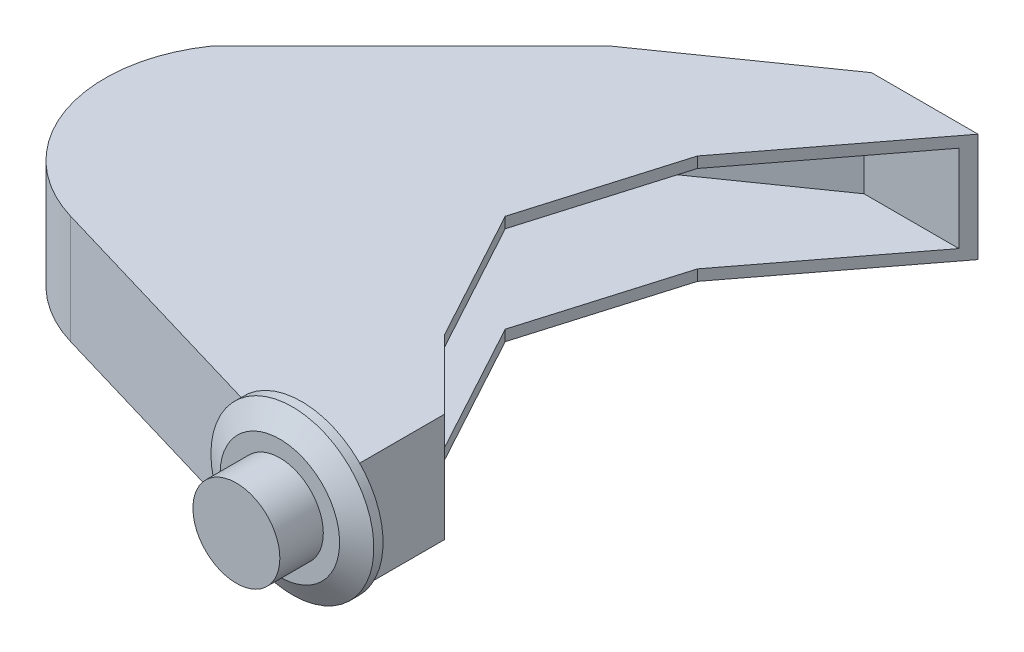
ISO-10303-21;
HEADER;
FILE_DESCRIPTION(('STEP AP214'),'2;1');
FILE_NAME('part.step','',(''),(''),'','','');
FILE_SCHEMA(('AUTOMOTIVE_DESIGN { 1 0 10303 214 1 1 1 1 }'));
ENDSEC;
DATA;
#1=APPLICATION_CONTEXT('core data for automotive mechanical design processes');
#2=APPLICATION_PROTOCOL_DEFINITION('international standard','automotive_design',2000,#1);
#3=PRODUCT_CONTEXT('',#1,'mechanical');
#4=PRODUCT('Part','Part','',(#3));
#5=PRODUCT_RELATED_PRODUCT_CATEGORY('part','',(#4));
#6=PRODUCT_DEFINITION_FORMATION('','',#4);
#7=PRODUCT_DEFINITION_CONTEXT('part definition',#1,'design');
#8=PRODUCT_DEFINITION('design','',#6,#7);
#9=PRODUCT_DEFINITION_SHAPE('','',#8);
#10=(LENGTH_UNIT() NAMED_UNIT(*) SI_UNIT(.MILLI.,.METRE.));
#11=(NAMED_UNIT(*) PLANE_ANGLE_UNIT() SI_UNIT($,.RADIAN.));
#12=(NAMED_UNIT(*) SI_UNIT($,.STERADIAN.) SOLID_ANGLE_UNIT());
#13=UNCERTAINTY_MEASURE_WITH_UNIT(LENGTH_MEASURE(1.E-05),#10,'distance_accuracy_value','');
#14=(GEOMETRIC_REPRESENTATION_CONTEXT(3) GLOBAL_UNCERTAINTY_ASSIGNED_CONTEXT((#13)) GLOBAL_UNIT_ASSIGNED_CONTEXT((#10,
#11,#12)) REPRESENTATION_CONTEXT('',''));
#15=CARTESIAN_POINT('',(0.,0.,0.));
#16=DIRECTION('',(0.,0.,1.));
#17=DIRECTION('',(1.,0.,0.));
#18=AXIS2_PLACEMENT_3D('',#15,#16,#17);
#19=CARTESIAN_POINT('',(-1.21758809619156,5.,-20.3540098135883));
#20=DIRECTION('',(-0.707106781186546,0.,0.707106781186549));
#21=DIRECTION('',(0.707106781186549,0.,0.707106781186546));
#22=AXIS2_PLACEMENT_3D('',#19,#20,#21);
#23=PLANE('',#22);
#24=DIRECTION('',(-0.707106781186549,0.,-0.707106781186546));
#25=VECTOR('',#24,1.);
#26=CARTESIAN_POINT('',(-15.1417044265505,-4.,-34.2781261439471));
#27=LINE('',#26,#25);
#28=CARTESIAN_POINT('',(4.09320586004261,-4.,-15.0432158573541));
#29=VERTEX_POINT('',#28);
#30=CARTESIAN_POINT('',(-1.21758809619156,-4.,-20.3540098135883));
#31=VERTEX_POINT('',#30);
#32=EDGE_CURVE('E316',#29,#31,#27,.T.);
#33=ORIENTED_EDGE('',*,*,#32,.F.);
#34=DIRECTION('',(0.,-1.,0.));
#35=VECTOR('',#34,1.);
#36=CARTESIAN_POINT('',(4.09320586004261,5.,-15.0432158573541));
#37=LINE('',#36,#35);
#38=CARTESIAN_POINT('',(4.09320586004261,4.,-15.0432158573541));
#39=VERTEX_POINT('',#38);
#40=EDGE_CURVE('E173',#39,#29,#37,.T.);
#41=ORIENTED_EDGE('',*,*,#40,.F.);
#42=DIRECTION('',(-0.707106781186549,0.,-0.707106781186546));
#43=VECTOR('',#42,1.);
#44=CARTESIAN_POINT('',(-15.1417044265505,4.,-34.2781261439471));
#45=LINE('',#44,#43);
#46=CARTESIAN_POINT('',(-1.21758809619156,4.,-20.3540098135883));
#47=VERTEX_POINT('',#46);
#48=EDGE_CURVE('E268',#39,#47,#45,.T.);
#49=ORIENTED_EDGE('',*,*,#48,.T.);
#50=DIRECTION('',(0.,-1.,0.));
#51=VECTOR('',#50,1.);
#52=CARTESIAN_POINT('',(-1.21758809619156,5.,-20.3540098135883));
#53=LINE('',#52,#51);
#54=CARTESIAN_POINT('',(-1.21758809619156,5.,-20.3540098135883));
#55=VERTEX_POINT('',#54);
#56=EDGE_CURVE('E50',#55,#47,#53,.T.);
#57=ORIENTED_EDGE('',*,*,#56,.F.);
#58=DIRECTION('',(-0.707106781186549,0.,-0.707106781186546));
#59=VECTOR('',#58,1.);
#60=CARTESIAN_POINT('',(-1.21758809619156,5.,-20.3540098135883));
#61=LINE('',#60,#59);
#62=CARTESIAN_POINT('',(5.09320586004261,5.,-14.0432158573541));
#63=VERTEX_POINT('',#62);
#64=EDGE_CURVE('E116',#63,#55,#61,.T.);
#65=ORIENTED_EDGE('',*,*,#64,.F.);
#66=DIRECTION('',(0.,-1.,0.));
#67=VECTOR('',#66,1.);
#68=CARTESIAN_POINT('',(5.09320586004261,5.,-14.0432158573541));
#69=LINE('',#68,#67);
#70=CARTESIAN_POINT('',(5.09320586004261,-5.,-14.0432158573541));
#71=VERTEX_POINT('',#70);
#72=EDGE_CURVE('E12',#63,#71,#69,.T.);
#73=ORIENTED_EDGE('',*,*,#72,.T.);
#74=DIRECTION('',(-0.707106781186549,0.,-0.707106781186546));
#75=VECTOR('',#74,1.);
#76=CARTESIAN_POINT('',(-1.21758809619156,-5.,-20.3540098135883));
#77=LINE('',#76,#75);
#78=CARTESIAN_POINT('',(-1.21758809619156,-5.,-20.3540098135883));
#79=VERTEX_POINT('',#78);
#80=EDGE_CURVE('E172',#71,#79,#77,.T.);
#81=ORIENTED_EDGE('',*,*,#80,.T.);
#82=EDGE_CURVE('E214',#31,#79,#53,.T.);
#83=ORIENTED_EDGE('',*,*,#82,.F.);
#84=EDGE_LOOP('',(#33,#41,#49,#57,#65,#73,#81,#83));
#85=FACE_BOUND('',#84,.T.);
#86=ADVANCED_FACE('F42',(#85),#23,.F.);
#87=CARTESIAN_POINT('',(-7.88833502325543,5.,-32.6318158692113));
#88=DIRECTION('',(-0.878683767214562,0.,0.477404270229776));
#89=DIRECTION('',(0.477404270229776,0.,0.878683767214562));
#90=AXIS2_PLACEMENT_3D('',#87,#88,#89);
#91=PLANE('',#90);
#92=DIRECTION('',(-0.477404270229776,0.,-0.878683767214562));
#93=VECTOR('',#92,1.);
#94=CARTESIAN_POINT('',(-8.49447980511238,-4.,-33.7474522671496));
#95=LINE('',#94,#93);
#96=CARTESIAN_POINT('',(-7.88833502325543,-4.,-32.6318158692113));
#97=VERTEX_POINT('',#96);
#98=EDGE_CURVE('E229',#31,#97,#95,.T.);
#99=ORIENTED_EDGE('',*,*,#98,.F.);
#100=ORIENTED_EDGE('',*,*,#82,.T.);
#101=DIRECTION('',(-0.477404270229776,0.,-0.878683767214562));
#102=VECTOR('',#101,1.);
#103=CARTESIAN_POINT('',(-7.88833502325543,-5.,-32.6318158692113));
#104=LINE('',#103,#102);
#105=CARTESIAN_POINT('',(-7.88833502325543,-5.,-32.6318158692113));
#106=VERTEX_POINT('',#105);
#107=EDGE_CURVE('E176',#79,#106,#104,.T.);
#108=ORIENTED_EDGE('',*,*,#107,.T.);
#109=DIRECTION('',(0.,-1.,0.));
#110=VECTOR('',#109,1.);
#111=CARTESIAN_POINT('',(-7.88833502325543,5.,-32.6318158692113));
#112=LINE('',#111,#110);
#113=EDGE_CURVE('E211',#97,#106,#112,.T.);
#114=ORIENTED_EDGE('',*,*,#113,.F.);
#115=EDGE_LOOP('',(#99,#100,#108,#114));
#116=FACE_BOUND('',#115,.T.);
#117=ADVANCED_FACE('F223',(#116),#91,.F.);
#118=CARTESIAN_POINT('',(-3.8479647744159,5.,-46.2858844235903));
#119=DIRECTION('',(-0.958899047162844,0.,-0.283747453469084));
#120=DIRECTION('',(-0.283747453469084,0.,0.958899047162844));
#121=AXIS2_PLACEMENT_3D('',#118,#119,#120);
#122=PLANE('',#121);
#123=DIRECTION('',(0.283747453469084,0.,-0.958899047162844));
#124=VECTOR('',#123,1.);
#125=CARTESIAN_POINT('',(-11.2225384643328,-4.,-21.3641746495007));
#126=LINE('',#125,#124);
#127=CARTESIAN_POINT('',(-3.8479647744159,-4.,-46.2858844235903));
#128=VERTEX_POINT('',#127);
#129=EDGE_CURVE('E244',#97,#128,#126,.T.);
#130=ORIENTED_EDGE('',*,*,#129,.F.);
#131=ORIENTED_EDGE('',*,*,#113,.T.);
#132=DIRECTION('',(0.283747453469084,0.,-0.958899047162844));
#133=VECTOR('',#132,1.);
#134=CARTESIAN_POINT('',(-3.8479647744159,-5.,-46.2858844235903));
#135=LINE('',#134,#133);
#136=CARTESIAN_POINT('',(-3.8479647744159,-5.,-46.2858844235903));
#137=VERTEX_POINT('',#136);
#138=EDGE_CURVE('E179',#106,#137,#135,.T.);
#139=ORIENTED_EDGE('',*,*,#138,.T.);
#140=DIRECTION('',(0.,-1.,0.));
#141=VECTOR('',#140,1.);
#142=CARTESIAN_POINT('',(-3.8479647744159,5.,-46.2858844235903));
#143=LINE('',#142,#141);
#144=EDGE_CURVE('E207',#128,#137,#143,.T.);
#145=ORIENTED_EDGE('',*,*,#144,.F.);
#146=EDGE_LOOP('',(#130,#131,#139,#145));
#147=FACE_BOUND('',#146,.T.);
#148=ADVANCED_FACE('F240',(#147),#122,.F.);
#149=CARTESIAN_POINT('',(7.3235458609851,5.,-60.9329761455605));
#150=DIRECTION('',(-0.795122252877776,0.,-0.606449175923728));
#151=DIRECTION('',(-0.606449175923728,0.,0.795122252877777));
#152=AXIS2_PLACEMENT_3D('',#149,#150,#151);
#153=PLANE('',#152);
#154=DIRECTION('',(0.606449175923728,0.,-0.795122252877777));
#155=VECTOR('',#154,1.);
#156=CARTESIAN_POINT('',(-21.5012922634337,-4.,-23.1404106046558));
#157=LINE('',#156,#155);
#158=CARTESIAN_POINT('',(6.56083399657832,-4.,-59.9329761455605));
#159=VERTEX_POINT('',#158);
#160=EDGE_CURVE('E323',#128,#159,#157,.T.);
#161=ORIENTED_EDGE('',*,*,#160,.F.);
#162=ORIENTED_EDGE('',*,*,#144,.T.);
#163=DIRECTION('',(0.606449175923728,0.,-0.795122252877776));
#164=VECTOR('',#163,1.);
#165=CARTESIAN_POINT('',(7.3235458609851,-5.,-60.9329761455605));
#166=LINE('',#165,#164);
#167=CARTESIAN_POINT('',(7.3235458609851,-5.,-60.9329761455605));
#168=VERTEX_POINT('',#167);
#169=EDGE_CURVE('E182',#137,#168,#166,.T.);
#170=ORIENTED_EDGE('',*,*,#169,.T.);
#171=DIRECTION('',(0.,-1.,0.));
#172=VECTOR('',#171,1.);
#173=CARTESIAN_POINT('',(7.3235458609851,5.,-60.9329761455605));
#174=LINE('',#173,#172);
#175=CARTESIAN_POINT('',(7.3235458609851,5.,-60.9329761455605));
#176=VERTEX_POINT('',#175);
#177=EDGE_CURVE('E204',#176,#168,#174,.T.);
#178=ORIENTED_EDGE('',*,*,#177,.F.);
#179=DIRECTION('',(0.606449175923728,0.,-0.795122252877776));
#180=VECTOR('',#179,1.);
#181=CARTESIAN_POINT('',(7.3235458609851,5.,-60.9329761455605));
#182=LINE('',#181,#180);
#183=CARTESIAN_POINT('',(-3.8479647744159,5.,-46.2858844235903));
#184=VERTEX_POINT('',#183);
#185=EDGE_CURVE('E343',#184,#176,#182,.T.);
#186=ORIENTED_EDGE('',*,*,#185,.F.);
#187=CARTESIAN_POINT('',(-3.8479647744159,4.,-46.2858844235903));
#188=VERTEX_POINT('',#187);
#189=EDGE_CURVE('E208',#184,#188,#143,.T.);
#190=ORIENTED_EDGE('',*,*,#189,.T.);
#191=DIRECTION('',(0.606449175923728,0.,-0.795122252877777));
#192=VECTOR('',#191,1.);
#193=CARTESIAN_POINT('',(-21.5012922634337,4.,-23.1404106046558));
#194=LINE('',#193,#192);
#195=CARTESIAN_POINT('',(6.56083399657832,4.,-59.9329761455605));
#196=VERTEX_POINT('',#195);
#197=EDGE_CURVE('E329',#188,#196,#194,.T.);
#198=ORIENTED_EDGE('',*,*,#197,.T.);
#199=DIRECTION('',(0.,-1.,0.));
#200=VECTOR('',#199,1.);
#201=CARTESIAN_POINT('',(6.56083399657832,5.,-59.9329761455605));
#202=LINE('',#201,#200);
#203=EDGE_CURVE('E313',#196,#159,#202,.T.);
#204=ORIENTED_EDGE('',*,*,#203,.T.);
#205=EDGE_LOOP('',(#161,#162,#170,#178,#186,#190,#198,#204));
#206=FACE_BOUND('',#205,.T.);
#207=ADVANCED_FACE('F371',(#206),#153,.F.);
#208=CARTESIAN_POINT('',(5.09320586004261,5.,-14.0432158573541));
#209=DIRECTION('',(-1.,0.,0.));
#210=DIRECTION('',(0.,0.,1.));
#211=AXIS2_PLACEMENT_3D('',#208,#209,#210);
#212=PLANE('',#211);
#213=DIRECTION('',(0.,0.,-1.));
#214=VECTOR('',#213,1.);
#215=CARTESIAN_POINT('',(5.09320586004261,-5.,-14.0432158573541));
#216=LINE('',#215,#214);
#217=CARTESIAN_POINT('',(5.09320586004261,-5.,-6.));
#218=VERTEX_POINT('',#217);
#219=EDGE_CURVE('E169',#218,#71,#216,.T.);
#220=ORIENTED_EDGE('',*,*,#219,.T.);
#221=ORIENTED_EDGE('',*,*,#72,.F.);
#222=DIRECTION('',(0.,0.,-1.));
#223=VECTOR('',#222,1.);
#224=CARTESIAN_POINT('',(5.09320586004261,5.,-14.0432158573541));
#225=LINE('',#224,#223);
#226=CARTESIAN_POINT('',(5.09320586004261,5.,-6.));
#227=VERTEX_POINT('',#226);
#228=EDGE_CURVE('E194',#227,#63,#225,.T.);
#229=ORIENTED_EDGE('',*,*,#228,.F.);
#230=DIRECTION('',(0.,-1.,0.));
#231=VECTOR('',#230,1.);
#232=CARTESIAN_POINT('',(5.09320586004261,5.,-6.));
#233=LINE('',#232,#231);
#234=EDGE_CURVE('E165',#227,#218,#233,.T.);
#235=ORIENTED_EDGE('',*,*,#234,.T.);
#236=EDGE_LOOP('',(#220,#221,#229,#235));
#237=FACE_BOUND('',#236,.T.);
#238=ADVANCED_FACE('F44',(#237),#212,.F.);
#239=ORIENTED_EDGE('',*,*,#56,.T.);
#240=DIRECTION('',(-0.477404270229776,0.,-0.878683767214562));
#241=VECTOR('',#240,1.);
#242=CARTESIAN_POINT('',(-8.49447980511238,4.,-33.7474522671496));
#243=LINE('',#242,#241);
#244=CARTESIAN_POINT('',(-7.88833502325543,4.,-32.6318158692113));
#245=VERTEX_POINT('',#244);
#246=EDGE_CURVE('E264',#47,#245,#243,.T.);
#247=ORIENTED_EDGE('',*,*,#246,.T.);
#248=CARTESIAN_POINT('',(-7.88833502325543,5.,-32.6318158692113));
#249=VERTEX_POINT('',#248);
#250=EDGE_CURVE('E212',#249,#245,#112,.T.);
#251=ORIENTED_EDGE('',*,*,#250,.F.);
#252=DIRECTION('',(-0.477404270229776,0.,-0.878683767214562));
#253=VECTOR('',#252,1.);
#254=CARTESIAN_POINT('',(-7.88833502325543,5.,-32.6318158692113));
#255=LINE('',#254,#253);
#256=EDGE_CURVE('E339',#55,#249,#255,.T.);
#257=ORIENTED_EDGE('',*,*,#256,.F.);
#258=EDGE_LOOP('',(#239,#247,#251,#257));
#259=FACE_BOUND('',#258,.T.);
#260=ADVANCED_FACE('F362',(#259),#91,.F.);
#261=ORIENTED_EDGE('',*,*,#250,.T.);
#262=DIRECTION('',(0.283747453469084,0.,-0.958899047162844));
#263=VECTOR('',#262,1.);
#264=CARTESIAN_POINT('',(-11.2225384643328,4.,-21.3641746495007));
#265=LINE('',#264,#263);
#266=EDGE_CURVE('E332',#245,#188,#265,.T.);
#267=ORIENTED_EDGE('',*,*,#266,.T.);
#268=ORIENTED_EDGE('',*,*,#189,.F.);
#269=DIRECTION('',(0.283747453469084,0.,-0.958899047162844));
#270=VECTOR('',#269,1.);
#271=CARTESIAN_POINT('',(-3.8479647744159,5.,-46.2858844235903));
#272=LINE('',#271,#270);
#273=EDGE_CURVE('E341',#249,#184,#272,.T.);
#274=ORIENTED_EDGE('',*,*,#273,.F.);
#275=EDGE_LOOP('',(#261,#267,#268,#274));
#276=FACE_BOUND('',#275,.T.);
#277=ADVANCED_FACE('F366',(#276),#122,.F.);
#278=CARTESIAN_POINT('',(-2.482557918978,5.,-60.9329761455605));
#279=DIRECTION('',(0.,0.,1.));
#280=DIRECTION('',(1.,0.,0.));
#281=AXIS2_PLACEMENT_3D('',#278,#279,#280);
#282=PLANE('',#281);
#283=DIRECTION('',(-1.,0.,0.));
#284=VECTOR('',#283,1.);
#285=CARTESIAN_POINT('',(-2.482557918978,-5.,-60.9329761455605));
#286=LINE('',#285,#284);
#287=CARTESIAN_POINT('',(-2.482557918978,-5.,-60.9329761455605));
#288=VERTEX_POINT('',#287);
#289=EDGE_CURVE('E184',#168,#288,#286,.T.);
#290=ORIENTED_EDGE('',*,*,#289,.T.);
#291=DIRECTION('',(0.,-1.,0.));
#292=VECTOR('',#291,1.);
#293=CARTESIAN_POINT('',(-2.482557918978,5.,-60.9329761455605));
#294=LINE('',#293,#292);
#295=CARTESIAN_POINT('',(-2.482557918978,5.,-60.9329761455605));
#296=VERTEX_POINT('',#295);
#297=EDGE_CURVE('E201',#296,#288,#294,.T.);
#298=ORIENTED_EDGE('',*,*,#297,.F.);
#299=DIRECTION('',(-1.,0.,0.));
#300=VECTOR('',#299,1.);
#301=CARTESIAN_POINT('',(-2.482557918978,5.,-60.9329761455605));
#302=LINE('',#301,#300);
#303=EDGE_CURVE('E345',#176,#296,#302,.T.);
#304=ORIENTED_EDGE('',*,*,#303,.F.);
#305=ORIENTED_EDGE('',*,*,#177,.T.);
#306=EDGE_LOOP('',(#290,#298,#304,#305));
#307=FACE_BOUND('',#306,.T.);
#308=ADVANCED_FACE('F373',(#307),#282,.F.);
#309=CARTESIAN_POINT('',(-16.5562604209447,5.,-51.0796221058565));
#310=DIRECTION('',(0.573531185950197,0.,0.819183727098238));
#311=DIRECTION('',(0.819183727098238,0.,-0.573531185950197));
#312=AXIS2_PLACEMENT_3D('',#309,#310,#311);
#313=PLANE('',#312);
#314=DIRECTION('',(-0.819183727098238,0.,0.573531185950197));
#315=VECTOR('',#314,1.);
#316=CARTESIAN_POINT('',(-16.5562604209447,-5.,-51.0796221058565));
#317=LINE('',#316,#315);
#318=CARTESIAN_POINT('',(-16.5562604209447,-5.,-51.0796221058565));
#319=VERTEX_POINT('',#318);
#320=EDGE_CURVE('E186',#288,#319,#317,.T.);
#321=ORIENTED_EDGE('',*,*,#320,.T.);
#322=DIRECTION('',(0.,-1.,0.));
#323=VECTOR('',#322,1.);
#324=CARTESIAN_POINT('',(-16.5562604209447,5.,-51.0796221058565));
#325=LINE('',#324,#323);
#326=CARTESIAN_POINT('',(-16.5562604209447,5.,-51.0796221058565));
#327=VERTEX_POINT('',#326);
#328=EDGE_CURVE('E198',#327,#319,#325,.T.);
#329=ORIENTED_EDGE('',*,*,#328,.F.);
#330=DIRECTION('',(-0.819183727098238,0.,0.573531185950197));
#331=VECTOR('',#330,1.);
#332=CARTESIAN_POINT('',(-16.5562604209447,5.,-51.0796221058565));
#333=LINE('',#332,#331);
#334=EDGE_CURVE('E347',#296,#327,#333,.T.);
#335=ORIENTED_EDGE('',*,*,#334,.F.);
#336=ORIENTED_EDGE('',*,*,#297,.T.);
#337=EDGE_LOOP('',(#321,#329,#335,#336));
#338=FACE_BOUND('',#337,.T.);
#339=ADVANCED_FACE('F353',(#338),#313,.F.);
#340=CARTESIAN_POINT('',(-35.0040666575898,5.,-32.6318158692113));
#341=DIRECTION('',(0.707106781186549,0.,0.707106781186546));
#342=DIRECTION('',(0.707106781186546,0.,-0.707106781186549));
#343=AXIS2_PLACEMENT_3D('',#340,#341,#342);
#344=PLANE('',#343);
#345=DIRECTION('',(-0.707106781186546,0.,0.707106781186549));
#346=VECTOR('',#345,1.);
#347=CARTESIAN_POINT('',(-35.0040666575898,-5.,-32.6318158692113));
#348=LINE('',#347,#346);
#349=CARTESIAN_POINT('',(-35.0040666575898,-5.,-32.6318158692113));
#350=VERTEX_POINT('',#349);
#351=EDGE_CURVE('E188',#319,#350,#348,.T.);
#352=ORIENTED_EDGE('',*,*,#351,.T.);
#353=DIRECTION('',(0.,-1.,0.));
#354=VECTOR('',#353,1.);
#355=CARTESIAN_POINT('',(-35.0040666575898,5.,-32.6318158692113));
#356=LINE('',#355,#354);
#357=CARTESIAN_POINT('',(-35.0040666575898,5.,-32.6318158692113));
#358=VERTEX_POINT('',#357);
#359=EDGE_CURVE('E160',#358,#350,#356,.T.);
#360=ORIENTED_EDGE('',*,*,#359,.F.);
#361=DIRECTION('',(-0.707106781186546,0.,0.707106781186549));
#362=VECTOR('',#361,1.);
#363=CARTESIAN_POINT('',(-35.0040666575898,5.,-32.6318158692113));
#364=LINE('',#363,#362);
#365=EDGE_CURVE('E148',#327,#358,#364,.T.);
#366=ORIENTED_EDGE('',*,*,#365,.F.);
#367=ORIENTED_EDGE('',*,*,#328,.T.);
#368=EDGE_LOOP('',(#352,#360,#366,#367));
#369=FACE_BOUND('',#368,.T.);
#370=ADVANCED_FACE('F357',(#369),#344,.F.);
#371=CARTESIAN_POINT('',(-24.2119608638383,5.,-25.2078697066593));
#372=DIRECTION('',(0.,-1.,0.));
#373=DIRECTION('',(0.,0.,-1.));
#374=AXIS2_PLACEMENT_3D('',#371,#372,#373);
#375=CYLINDRICAL_SURFACE('',#374,13.0990276008563);
#376=CARTESIAN_POINT('',(-24.2119608638383,-5.,-25.2078697066593));
#377=DIRECTION('',(0.,1.,0.));
#378=DIRECTION('',(0.,0.,-1.));
#379=AXIS2_PLACEMENT_3D('',#376,#377,#378);
#380=CIRCLE('',#379,13.0990276008563);
#381=CARTESIAN_POINT('',(-27.9287765885025,-5.,-12.6472246214384));
#382=VERTEX_POINT('',#381);
#383=EDGE_CURVE('E157',#350,#382,#380,.T.);
#384=ORIENTED_EDGE('',*,*,#383,.T.);
#385=DIRECTION('',(0.,-1.,0.));
#386=VECTOR('',#385,1.);
#387=CARTESIAN_POINT('',(-27.9287765885025,5.,-12.6472246214384));
#388=LINE('',#387,#386);
#389=CARTESIAN_POINT('',(-27.9287765885025,5.,-12.6472246214384));
#390=VERTEX_POINT('',#389);
#391=EDGE_CURVE('E154',#390,#382,#388,.T.);
#392=ORIENTED_EDGE('',*,*,#391,.F.);
#393=CARTESIAN_POINT('',(-24.2119608638383,5.,-25.2078697066593));
#394=DIRECTION('',(0.,1.,0.));
#395=DIRECTION('',(0.,0.,-1.));
#396=AXIS2_PLACEMENT_3D('',#393,#394,#395);
#397=CIRCLE('',#396,13.0990276008563);
#398=EDGE_CURVE('E141',#358,#390,#397,.T.);
#399=ORIENTED_EDGE('',*,*,#398,.F.);
#400=ORIENTED_EDGE('',*,*,#359,.T.);
#401=EDGE_LOOP('',(#384,#392,#399,#400));
#402=FACE_BOUND('',#401,.T.);
#403=ADVANCED_FACE('F155',(#402),#375,.T.);
#404=CARTESIAN_POINT('',(-5.46507769765346,5.,-6.));
#405=DIRECTION('',(0.283747453469083,0.,-0.958899047162844));
#406=DIRECTION('',(-0.958899047162844,0.,-0.283747453469083));
#407=AXIS2_PLACEMENT_3D('',#404,#405,#406);
#408=PLANE('',#407);
#409=DIRECTION('',(0.958899047162844,0.,0.283747453469083));
#410=VECTOR('',#409,1.);
#411=CARTESIAN_POINT('',(-5.46507769765346,-5.,-6.));
#412=LINE('',#411,#410);
#413=CARTESIAN_POINT('',(-5.46507769765346,-5.,-6.));
#414=VERTEX_POINT('',#413);
#415=EDGE_CURVE('E191',#382,#414,#412,.T.);
#416=ORIENTED_EDGE('',*,*,#415,.T.);
#417=DIRECTION('',(0.,-1.,0.));
#418=VECTOR('',#417,1.);
#419=CARTESIAN_POINT('',(-5.46507769765346,5.,-6.));
#420=LINE('',#419,#418);
#421=CARTESIAN_POINT('',(-5.46507769765346,5.,-6.));
#422=VERTEX_POINT('',#421);
#423=EDGE_CURVE('E161',#422,#414,#420,.T.);
#424=ORIENTED_EDGE('',*,*,#423,.F.);
#425=DIRECTION('',(0.958899047162844,0.,0.283747453469083));
#426=VECTOR('',#425,1.);
#427=CARTESIAN_POINT('',(-5.46507769765346,5.,-6.));
#428=LINE('',#427,#426);
#429=EDGE_CURVE('E145',#390,#422,#428,.T.);
#430=ORIENTED_EDGE('',*,*,#429,.F.);
#431=ORIENTED_EDGE('',*,*,#391,.T.);
#432=EDGE_LOOP('',(#416,#424,#430,#431));
#433=FACE_BOUND('',#432,.T.);
#434=ADVANCED_FACE('F163',(#433),#408,.F.);
#435=CARTESIAN_POINT('',(5.09320586004261,5.,-6.));
#436=DIRECTION('',(0.,0.,-1.));
#437=DIRECTION('',(-1.,0.,0.));
#438=AXIS2_PLACEMENT_3D('',#435,#436,#437);
#439=PLANE('',#438);
#440=DIRECTION('',(1.,0.,0.));
#441=VECTOR('',#440,1.);
#442=CARTESIAN_POINT('',(5.09320586004261,-5.,-6.));
#443=LINE('',#442,#441);
#444=EDGE_CURVE('E108',#414,#218,#443,.T.);
#445=ORIENTED_EDGE('',*,*,#444,.T.);
#446=ORIENTED_EDGE('',*,*,#234,.F.);
#447=DIRECTION('',(1.,0.,0.));
#448=VECTOR('',#447,1.);
#449=CARTESIAN_POINT('',(5.09320586004261,5.,-6.));
#450=LINE('',#449,#448);
#451=EDGE_CURVE('E66',#422,#227,#450,.T.);
#452=ORIENTED_EDGE('',*,*,#451,.F.);
#453=ORIENTED_EDGE('',*,*,#423,.T.);
#454=EDGE_LOOP('',(#445,#446,#452,#453));
#455=FACE_BOUND('',#454,.T.);
#456=ADVANCED_FACE('F358',(#455),#439,.F.);
#457=CARTESIAN_POINT('',(-24.2119608638383,5.,-25.2078697066593));
#458=DIRECTION('',(0.,-1.,0.));
#459=DIRECTION('',(0.,0.,-1.));
#460=AXIS2_PLACEMENT_3D('',#457,#458,#459);
#461=PLANE('',#460);
#462=ORIENTED_EDGE('',*,*,#228,.T.);
#463=ORIENTED_EDGE('',*,*,#64,.T.);
#464=ORIENTED_EDGE('',*,*,#256,.T.);
#465=ORIENTED_EDGE('',*,*,#273,.T.);
#466=ORIENTED_EDGE('',*,*,#185,.T.);
#467=ORIENTED_EDGE('',*,*,#303,.T.);
#468=ORIENTED_EDGE('',*,*,#334,.T.);
#469=ORIENTED_EDGE('',*,*,#365,.T.);
#470=ORIENTED_EDGE('',*,*,#398,.T.);
#471=ORIENTED_EDGE('',*,*,#429,.T.);
#472=ORIENTED_EDGE('',*,*,#451,.T.);
#473=EDGE_LOOP('',(#462,#463,#464,#465,#466,#467,#468,#469,#470,#471,#472));
#474=FACE_BOUND('',#473,.T.);
#475=ADVANCED_FACE('F143',(#474),#461,.F.);
#476=CARTESIAN_POINT('',(-24.2119608638383,-5.,-25.2078697066593));
#477=DIRECTION('',(0.,-1.,0.));
#478=DIRECTION('',(0.,0.,-1.));
#479=AXIS2_PLACEMENT_3D('',#476,#477,#478);
#480=PLANE('',#479);
#481=ORIENTED_EDGE('',*,*,#219,.F.);
#482=ORIENTED_EDGE('',*,*,#444,.F.);
#483=ORIENTED_EDGE('',*,*,#415,.F.);
#484=ORIENTED_EDGE('',*,*,#383,.F.);
#485=ORIENTED_EDGE('',*,*,#351,.F.);
#486=ORIENTED_EDGE('',*,*,#320,.F.);
#487=ORIENTED_EDGE('',*,*,#289,.F.);
#488=ORIENTED_EDGE('',*,*,#169,.F.);
#489=ORIENTED_EDGE('',*,*,#138,.F.);
#490=ORIENTED_EDGE('',*,*,#107,.F.);
#491=ORIENTED_EDGE('',*,*,#80,.F.);
#492=EDGE_LOOP('',(#481,#482,#483,#484,#485,#486,#487,#488,#489,#490,#491));
#493=FACE_BOUND('',#492,.T.);
#494=ADVANCED_FACE('F234',(#493),#480,.T.);
#495=CARTESIAN_POINT('',(4.09320586004261,5.,-14.0432158573541));
#496=DIRECTION('',(-1.,0.,0.));
#497=DIRECTION('',(0.,0.,1.));
#498=AXIS2_PLACEMENT_3D('',#495,#496,#497);
#499=PLANE('',#498);
#500=DIRECTION('',(0.,0.,-1.));
#501=VECTOR('',#500,1.);
#502=CARTESIAN_POINT('',(4.09320586004261,-4.,-25.2078697066593));
#503=LINE('',#502,#501);
#504=CARTESIAN_POINT('',(4.09320586004261,-4.,-7.));
#505=VERTEX_POINT('',#504);
#506=EDGE_CURVE('E311',#505,#29,#503,.T.);
#507=ORIENTED_EDGE('',*,*,#506,.F.);
#508=DIRECTION('',(0.,-1.,0.));
#509=VECTOR('',#508,1.);
#510=CARTESIAN_POINT('',(4.09320586004261,5.,-7.));
#511=LINE('',#510,#509);
#512=CARTESIAN_POINT('',(4.09320586004261,4.,-7.));
#513=VERTEX_POINT('',#512);
#514=EDGE_CURVE('E582',#513,#505,#511,.T.);
#515=ORIENTED_EDGE('',*,*,#514,.F.);
#516=DIRECTION('',(0.,0.,-1.));
#517=VECTOR('',#516,1.);
#518=CARTESIAN_POINT('',(4.09320586004261,4.,-25.2078697066593));
#519=LINE('',#518,#517);
#520=EDGE_CURVE('E312',#513,#39,#519,.T.);
#521=ORIENTED_EDGE('',*,*,#520,.T.);
#522=ORIENTED_EDGE('',*,*,#40,.T.);
#523=EDGE_LOOP('',(#507,#515,#521,#522));
#524=FACE_BOUND('',#523,.T.);
#525=ADVANCED_FACE('F309',(#524),#499,.T.);
#526=CARTESIAN_POINT('',(-2.482557918978,5.,-59.9329761455605));
#527=DIRECTION('',(0.,0.,1.));
#528=DIRECTION('',(1.,0.,0.));
#529=AXIS2_PLACEMENT_3D('',#526,#527,#528);
#530=PLANE('',#529);
#531=DIRECTION('',(-1.,0.,0.));
#532=VECTOR('',#531,1.);
#533=CARTESIAN_POINT('',(-24.2119608638383,-4.,-59.9329761455605));
#534=LINE('',#533,#532);
#535=CARTESIAN_POINT('',(-2.16728949533998,-4.,-59.9329761455605));
#536=VERTEX_POINT('',#535);
#537=EDGE_CURVE('E325',#159,#536,#534,.T.);
#538=ORIENTED_EDGE('',*,*,#537,.F.);
#539=ORIENTED_EDGE('',*,*,#203,.F.);
#540=DIRECTION('',(-1.,0.,0.));
#541=VECTOR('',#540,1.);
#542=CARTESIAN_POINT('',(-24.2119608638383,4.,-59.9329761455605));
#543=LINE('',#542,#541);
#544=CARTESIAN_POINT('',(-2.16728949533998,4.,-59.9329761455605));
#545=VERTEX_POINT('',#544);
#546=EDGE_CURVE('E57',#196,#545,#543,.T.);
#547=ORIENTED_EDGE('',*,*,#546,.T.);
#548=DIRECTION('',(0.,-1.,0.));
#549=VECTOR('',#548,1.);
#550=CARTESIAN_POINT('',(-2.16728949533998,5.,-59.9329761455605));
#551=LINE('',#550,#549);
#552=EDGE_CURVE('E328',#545,#536,#551,.T.);
#553=ORIENTED_EDGE('',*,*,#552,.T.);
#554=EDGE_LOOP('',(#538,#539,#547,#553));
#555=FACE_BOUND('',#554,.T.);
#556=ADVANCED_FACE('F416',(#555),#530,.T.);
#557=CARTESIAN_POINT('',(-15.9827292349945,5.,-50.2604383787582));
#558=DIRECTION('',(0.573531185950197,0.,0.819183727098238));
#559=DIRECTION('',(0.819183727098238,0.,-0.573531185950197));
#560=AXIS2_PLACEMENT_3D('',#557,#558,#559);
#561=PLANE('',#560);
#562=DIRECTION('',(-0.819183727098238,0.,0.573531185950197));
#563=VECTOR('',#562,1.);
#564=CARTESIAN_POINT('',(-33.2754372615178,-4.,-38.1533773927274));
#565=LINE('',#564,#563);
#566=CARTESIAN_POINT('',(-15.9110371466527,-4.,-50.3106318177753));
#567=VERTEX_POINT('',#566);
#568=EDGE_CURVE('E605',#536,#567,#565,.T.);
#569=ORIENTED_EDGE('',*,*,#568,.F.);
#570=ORIENTED_EDGE('',*,*,#552,.F.);
#571=DIRECTION('',(-0.819183727098238,0.,0.573531185950197));
#572=VECTOR('',#571,1.);
#573=CARTESIAN_POINT('',(-33.2754372615178,4.,-38.1533773927274));
#574=LINE('',#573,#572);
#575=CARTESIAN_POINT('',(-15.9110371466527,4.,-50.3106318177753));
#576=VERTEX_POINT('',#575);
#577=EDGE_CURVE('E607',#545,#576,#574,.T.);
#578=ORIENTED_EDGE('',*,*,#577,.T.);
#579=DIRECTION('',(0.,-1.,0.));
#580=VECTOR('',#579,1.);
#581=CARTESIAN_POINT('',(-15.9110371466527,5.,-50.3106318177753));
#582=LINE('',#581,#580);
#583=EDGE_CURVE('E603',#576,#567,#582,.T.);
#584=ORIENTED_EDGE('',*,*,#583,.T.);
#585=EDGE_LOOP('',(#569,#570,#578,#584));
#586=FACE_BOUND('',#585,.T.);
#587=ADVANCED_FACE('F424',(#586),#561,.T.);
#588=CARTESIAN_POINT('',(-34.2969598764032,5.,-31.9247090880247));
#589=DIRECTION('',(0.707106781186549,0.,0.707106781186546));
#590=DIRECTION('',(0.707106781186546,0.,-0.707106781186549));
#591=AXIS2_PLACEMENT_3D('',#588,#589,#590);
#592=PLANE('',#591);
#593=DIRECTION('',(-0.707106781186546,0.,0.707106781186549));
#594=VECTOR('',#593,1.);
#595=CARTESIAN_POINT('',(-32.6128800608035,-4.,-33.6087889036245));
#596=LINE('',#595,#594);
#597=CARTESIAN_POINT('',(-34.2308389877244,-4.,-31.9908299767036));
#598=VERTEX_POINT('',#597);
#599=EDGE_CURVE('E598',#567,#598,#596,.T.);
#600=ORIENTED_EDGE('',*,*,#599,.F.);
#601=ORIENTED_EDGE('',*,*,#583,.F.);
#602=DIRECTION('',(-0.707106781186546,0.,0.707106781186549));
#603=VECTOR('',#602,1.);
#604=CARTESIAN_POINT('',(-32.6128800608035,4.,-33.6087889036245));
#605=LINE('',#604,#603);
#606=CARTESIAN_POINT('',(-34.2308389877244,4.,-31.9908299767036));
#607=VERTEX_POINT('',#606);
#608=EDGE_CURVE('E600',#576,#607,#605,.T.);
#609=ORIENTED_EDGE('',*,*,#608,.T.);
#610=DIRECTION('',(0.,-1.,0.));
#611=VECTOR('',#610,1.);
#612=CARTESIAN_POINT('',(-34.2308389877244,4.,-31.9908299767036));
#613=LINE('',#612,#611);
#614=EDGE_CURVE('E596',#607,#598,#613,.T.);
#615=ORIENTED_EDGE('',*,*,#614,.T.);
#616=EDGE_LOOP('',(#600,#601,#609,#615));
#617=FACE_BOUND('',#616,.T.);
#618=ADVANCED_FACE('F433',(#617),#592,.T.);
#619=CARTESIAN_POINT('',(-24.2119608638383,5.,-25.2078697066593));
#620=DIRECTION('',(0.,-1.,0.));
#621=DIRECTION('',(0.,0.,-1.));
#622=AXIS2_PLACEMENT_3D('',#619,#620,#621);
#623=CYLINDRICAL_SURFACE('',#622,12.0990276008563);
#624=CARTESIAN_POINT('',(-24.2119608638383,-4.,-25.2078697066593));
#625=DIRECTION('',(0.,-1.,0.));
#626=DIRECTION('',(0.,0.,-1.));
#627=AXIS2_PLACEMENT_3D('',#624,#625,#626);
#628=CIRCLE('',#627,12.0990276008563);
#629=CARTESIAN_POINT('',(-27.6450291350334,-4.,-13.6061236686013));
#630=VERTEX_POINT('',#629);
#631=EDGE_CURVE('E591',#598,#630,#628,.F.);
#632=ORIENTED_EDGE('',*,*,#631,.F.);
#633=ORIENTED_EDGE('',*,*,#614,.F.);
#634=CARTESIAN_POINT('',(-24.2119608638383,4.,-25.2078697066593));
#635=DIRECTION('',(0.,-1.,0.));
#636=DIRECTION('',(0.,0.,-1.));
#637=AXIS2_PLACEMENT_3D('',#634,#635,#636);
#638=CIRCLE('',#637,12.0990276008563);
#639=CARTESIAN_POINT('',(-27.6450291350334,4.,-13.6061236686013));
#640=VERTEX_POINT('',#639);
#641=EDGE_CURVE('E593',#607,#640,#638,.F.);
#642=ORIENTED_EDGE('',*,*,#641,.T.);
#643=DIRECTION('',(0.,1.,0.));
#644=VECTOR('',#643,1.);
#645=CARTESIAN_POINT('',(-27.6450291350334,5.,-13.6061236686013));
#646=LINE('',#645,#644);
#647=EDGE_CURVE('E589',#640,#630,#646,.F.);
#648=ORIENTED_EDGE('',*,*,#647,.T.);
#649=EDGE_LOOP('',(#632,#633,#642,#648));
#650=FACE_BOUND('',#649,.T.);
#651=ADVANCED_FACE('F442',(#650),#623,.F.);
#652=CARTESIAN_POINT('',(-5.18133024418438,5.,-6.95889904716284));
#653=DIRECTION('',(0.283747453469083,0.,-0.958899047162844));
#654=DIRECTION('',(-0.958899047162844,0.,-0.283747453469083));
#655=AXIS2_PLACEMENT_3D('',#652,#653,#654);
#656=PLANE('',#655);
#657=DIRECTION('',(0.958899047162844,0.,0.283747453469083));
#658=VECTOR('',#657,1.);
#659=CARTESIAN_POINT('',(-27.6450291350334,-4.,-13.6061236686012));
#660=LINE('',#659,#658);
#661=CARTESIAN_POINT('',(-5.32022722469007,-4.,-7.));
#662=VERTEX_POINT('',#661);
#663=EDGE_CURVE('E579',#630,#662,#660,.T.);
#664=ORIENTED_EDGE('',*,*,#663,.F.);
#665=ORIENTED_EDGE('',*,*,#647,.F.);
#666=DIRECTION('',(0.958899047162844,0.,0.283747453469083));
#667=VECTOR('',#666,1.);
#668=CARTESIAN_POINT('',(-27.6450291350334,4.,-13.6061236686012));
#669=LINE('',#668,#667);
#670=CARTESIAN_POINT('',(-5.32022722469007,4.,-7.));
#671=VERTEX_POINT('',#670);
#672=EDGE_CURVE('E586',#640,#671,#669,.T.);
#673=ORIENTED_EDGE('',*,*,#672,.T.);
#674=DIRECTION('',(0.,-1.,0.));
#675=VECTOR('',#674,1.);
#676=CARTESIAN_POINT('',(-5.32022722469007,5.,-7.));
#677=LINE('',#676,#675);
#678=EDGE_CURVE('E583',#671,#662,#677,.T.);
#679=ORIENTED_EDGE('',*,*,#678,.T.);
#680=EDGE_LOOP('',(#664,#665,#673,#679));
#681=FACE_BOUND('',#680,.T.);
#682=ADVANCED_FACE('F451',(#681),#656,.T.);
#683=CARTESIAN_POINT('',(5.09320586004261,5.,-7.));
#684=DIRECTION('',(0.,0.,-1.));
#685=DIRECTION('',(-1.,0.,0.));
#686=AXIS2_PLACEMENT_3D('',#683,#684,#685);
#687=PLANE('',#686);
#688=DIRECTION('',(1.,0.,0.));
#689=VECTOR('',#688,1.);
#690=CARTESIAN_POINT('',(-24.2119608638383,-4.,-7.));
#691=LINE('',#690,#689);
#692=EDGE_CURVE('E276',#662,#505,#691,.T.);
#693=ORIENTED_EDGE('',*,*,#692,.F.);
#694=ORIENTED_EDGE('',*,*,#678,.F.);
#695=DIRECTION('',(1.,0.,0.));
#696=VECTOR('',#695,1.);
#697=CARTESIAN_POINT('',(-24.2119608638383,4.,-7.));
#698=LINE('',#697,#696);
#699=EDGE_CURVE('E577',#671,#513,#698,.T.);
#700=ORIENTED_EDGE('',*,*,#699,.T.);
#701=ORIENTED_EDGE('',*,*,#514,.T.);
#702=EDGE_LOOP('',(#693,#694,#700,#701));
#703=FACE_BOUND('',#702,.T.);
#704=ADVANCED_FACE('F460',(#703),#687,.T.);
#705=CARTESIAN_POINT('',(-24.2119608638383,4.,-25.2078697066593));
#706=DIRECTION('',(0.,-1.,0.));
#707=DIRECTION('',(0.,0.,-1.));
#708=AXIS2_PLACEMENT_3D('',#705,#706,#707);
#709=PLANE('',#708);
#710=ORIENTED_EDGE('',*,*,#520,.F.);
#711=ORIENTED_EDGE('',*,*,#699,.F.);
#712=ORIENTED_EDGE('',*,*,#672,.F.);
#713=ORIENTED_EDGE('',*,*,#641,.F.);
#714=ORIENTED_EDGE('',*,*,#608,.F.);
#715=ORIENTED_EDGE('',*,*,#577,.F.);
#716=ORIENTED_EDGE('',*,*,#546,.F.);
#717=ORIENTED_EDGE('',*,*,#197,.F.);
#718=ORIENTED_EDGE('',*,*,#266,.F.);
#719=ORIENTED_EDGE('',*,*,#246,.F.);
#720=ORIENTED_EDGE('',*,*,#48,.F.);
#721=EDGE_LOOP('',(#710,#711,#712,#713,#714,#715,#716,#717,#718,#719,#720));
#722=FACE_BOUND('',#721,.T.);
#723=ADVANCED_FACE('F469',(#722),#709,.T.);
#724=CARTESIAN_POINT('',(-24.2119608638383,-4.,-25.2078697066593));
#725=DIRECTION('',(0.,-1.,0.));
#726=DIRECTION('',(0.,0.,-1.));
#727=AXIS2_PLACEMENT_3D('',#724,#725,#726);
#728=PLANE('',#727);
#729=ORIENTED_EDGE('',*,*,#506,.T.);
#730=ORIENTED_EDGE('',*,*,#32,.T.);
#731=ORIENTED_EDGE('',*,*,#98,.T.);
#732=ORIENTED_EDGE('',*,*,#129,.T.);
#733=ORIENTED_EDGE('',*,*,#160,.T.);
#734=ORIENTED_EDGE('',*,*,#537,.T.);
#735=ORIENTED_EDGE('',*,*,#568,.T.);
#736=ORIENTED_EDGE('',*,*,#599,.T.);
#737=ORIENTED_EDGE('',*,*,#631,.T.);
#738=ORIENTED_EDGE('',*,*,#663,.T.);
#739=ORIENTED_EDGE('',*,*,#692,.T.);
#740=EDGE_LOOP('',(#729,#730,#731,#732,#733,#734,#735,#736,#737,#738,#739));
#741=FACE_BOUND('',#740,.T.);
#742=ADVANCED_FACE('F315',(#741),#728,.F.);
#743=CLOSED_SHELL('',(#86,#117,#148,#207,#238,#260,#277,#308,#339,#370,#403,#434,#456,#475,#494,
#525,#556,#587,#618,#651,#682,#704,#723,#742));
#744=MANIFOLD_SOLID_BREP('B2',#743);
#745=CARTESIAN_POINT('',(0.,0.,-4.));
#746=DIRECTION('',(0.,0.,1.));
#747=DIRECTION('',(1.,0.,0.));
#748=AXIS2_PLACEMENT_3D('',#745,#746,#747);
#749=CYLINDRICAL_SURFACE('',#748,4.);
#750=CARTESIAN_POINT('',(0.,0.,-4.));
#751=DIRECTION('',(0.,0.,1.));
#752=DIRECTION('',(1.,0.,0.));
#753=AXIS2_PLACEMENT_3D('',#750,#751,#752);
#754=CIRCLE('',#753,4.);
#755=CARTESIAN_POINT('',(4.,0.,-4.));
#756=VERTEX_POINT('',#755);
#757=EDGE_CURVE('E643',#756,#756,#754,.T.);
#758=ORIENTED_EDGE('',*,*,#757,.T.);
#759=EDGE_LOOP('',(#758));
#760=FACE_BOUND('',#759,.T.);
#761=CARTESIAN_POINT('',(0.,0.,0.));
#762=DIRECTION('',(0.,0.,1.));
#763=DIRECTION('',(1.,0.,0.));
#764=AXIS2_PLACEMENT_3D('',#761,#762,#763);
#765=CIRCLE('',#764,4.);
#766=CARTESIAN_POINT('',(4.,0.,0.));
#767=VERTEX_POINT('',#766);
#768=EDGE_CURVE('E639',#767,#767,#765,.T.);
#769=ORIENTED_EDGE('',*,*,#768,.F.);
#770=EDGE_LOOP('',(#769));
#771=FACE_BOUND('',#770,.T.);
#772=ADVANCED_FACE('F628',(#760,#771),#749,.T.);
#773=CARTESIAN_POINT('',(0.,0.,0.));
#774=DIRECTION('',(0.,0.,1.));
#775=DIRECTION('',(1.,0.,0.));
#776=AXIS2_PLACEMENT_3D('',#773,#774,#775);
#777=PLANE('',#776);
#778=ORIENTED_EDGE('',*,*,#768,.T.);
#779=EDGE_LOOP('',(#778));
#780=FACE_BOUND('',#779,.T.);
#781=ADVANCED_FACE('F656',(#780),#777,.T.);
#782=CARTESIAN_POINT('',(0.,0.,-6.));
#783=DIRECTION('',(0.,0.,1.));
#784=DIRECTION('',(1.,0.,0.));
#785=AXIS2_PLACEMENT_3D('',#782,#783,#784);
#786=CYLINDRICAL_SURFACE('',#785,7.5);
#787=CARTESIAN_POINT('',(0.,0.,-5.15470053837925));
#788=DIRECTION('',(0.,0.,-1.));
#789=DIRECTION('',(-1.,0.,0.));
#790=AXIS2_PLACEMENT_3D('',#787,#788,#789);
#791=CIRCLE('',#790,7.5);
#792=CARTESIAN_POINT('',(-7.5,0.,-5.15470053837925));
#793=VERTEX_POINT('',#792);
#794=EDGE_CURVE('E635',#793,#793,#791,.T.);
#795=ORIENTED_EDGE('',*,*,#794,.T.);
#796=EDGE_LOOP('',(#795));
#797=FACE_BOUND('',#796,.T.);
#798=CARTESIAN_POINT('',(0.,0.,-6.));
#799=DIRECTION('',(0.,0.,-1.));
#800=DIRECTION('',(-1.,0.,0.));
#801=AXIS2_PLACEMENT_3D('',#798,#799,#800);
#802=CIRCLE('',#801,7.5);
#803=CARTESIAN_POINT('',(-7.5,0.,-6.));
#804=VERTEX_POINT('',#803);
#805=EDGE_CURVE('E648',#804,#804,#802,.T.);
#806=ORIENTED_EDGE('',*,*,#805,.F.);
#807=EDGE_LOOP('',(#806));
#808=FACE_BOUND('',#807,.T.);
#809=ADVANCED_FACE('F654',(#797,#808),#786,.T.);
#810=CARTESIAN_POINT('',(0.,0.,-6.));
#811=DIRECTION('',(0.,0.,-1.));
#812=DIRECTION('',(-1.,0.,0.));
#813=AXIS2_PLACEMENT_3D('',#810,#811,#812);
#814=PLANE('',#813);
#815=ORIENTED_EDGE('',*,*,#805,.T.);
#816=EDGE_LOOP('',(#815));
#817=FACE_BOUND('',#816,.T.);
#818=ADVANCED_FACE('F652',(#817),#814,.T.);
#819=CARTESIAN_POINT('',(0.,0.,-4.));
#820=DIRECTION('',(0.,0.,-1.));
#821=DIRECTION('',(-1.,0.,0.));
#822=AXIS2_PLACEMENT_3D('',#819,#820,#821);
#823=PLANE('',#822);
#824=CARTESIAN_POINT('',(0.,0.,-4.));
#825=DIRECTION('',(0.,0.,-1.));
#826=DIRECTION('',(-1.,0.,0.));
#827=AXIS2_PLACEMENT_3D('',#824,#825,#826);
#828=CIRCLE('',#827,5.49999999999999);
#829=CARTESIAN_POINT('',(-5.49999999999999,0.,-4.));
#830=VERTEX_POINT('',#829);
#831=EDGE_CURVE('E41',#830,#830,#828,.F.);
#832=ORIENTED_EDGE('',*,*,#831,.T.);
#833=EDGE_LOOP('',(#832));
#834=FACE_BOUND('',#833,.T.);
#835=ORIENTED_EDGE('',*,*,#757,.F.);
#836=EDGE_LOOP('',(#835));
#837=FACE_BOUND('',#836,.T.);
#838=ADVANCED_FACE('F662',(#834,#837),#823,.F.);
#839=CARTESIAN_POINT('',(0.,0.,-5.15470053837925));
#840=DIRECTION('',(0.,0.,-1.));
#841=DIRECTION('',(-1.,0.,0.));
#842=AXIS2_PLACEMENT_3D('',#839,#840,#841);
#843=CONICAL_SURFACE('',#842,7.5,1.0471975511966);
#844=CARTESIAN_POINT('',(-5.49999999999999,0.,-4.));
#845=CARTESIAN_POINT('',(-5.52083333333332,0.,-4.01202813060812));
#846=CARTESIAN_POINT('',(-5.54166666666666,0.,-4.02405626121623));
#847=CARTESIAN_POINT('',(-5.58333333333332,0.,-4.04811252243247));
#848=CARTESIAN_POINT('',(-5.60416666666666,0.,-4.06014065304059));
#849=CARTESIAN_POINT('',(-5.64583333333332,0.,-4.08419691425682));
#850=CARTESIAN_POINT('',(-5.66666666666666,0.,-4.09622504486494));
#851=CARTESIAN_POINT('',(-5.70833333333332,0.,-4.12028130608117));
#852=CARTESIAN_POINT('',(-5.72916666666666,0.,-4.13230943668929));
#853=CARTESIAN_POINT('',(-5.77083333333333,0.,-4.15636569790552));
#854=CARTESIAN_POINT('',(-5.79166666666666,0.,-4.16839382851364));
#855=CARTESIAN_POINT('',(-5.83333333333333,0.,-4.19245008972987));
#856=CARTESIAN_POINT('',(-5.85416666666666,0.,-4.20447822033799));
#857=CARTESIAN_POINT('',(-5.89583333333333,0.,-4.22853448155423));
#858=CARTESIAN_POINT('',(-5.91666666666666,0.,-4.24056261216234));
#859=CARTESIAN_POINT('',(-5.95833333333333,0.,-4.26461887337858));
#860=CARTESIAN_POINT('',(-5.97916666666666,0.,-4.27664700398669));
#861=CARTESIAN_POINT('',(-6.02083333333333,0.,-4.30070326520293));
#862=CARTESIAN_POINT('',(-6.04166666666666,0.,-4.31273139581105));
#863=CARTESIAN_POINT('',(-6.08333333333333,0.,-4.33678765702728));
#864=CARTESIAN_POINT('',(-6.10416666666666,0.,-4.3488157876354));
#865=CARTESIAN_POINT('',(-6.14583333333333,0.,-4.37287204885163));
#866=CARTESIAN_POINT('',(-6.16666666666666,0.,-4.38490017945975));
#867=CARTESIAN_POINT('',(-6.20833333333333,0.,-4.40895644067598));
#868=CARTESIAN_POINT('',(-6.22916666666666,0.,-4.4209845712841));
#869=CARTESIAN_POINT('',(-6.27083333333333,0.,-4.44504083250033));
#870=CARTESIAN_POINT('',(-6.29166666666666,0.,-4.45706896310845));
#871=CARTESIAN_POINT('',(-6.33333333333333,0.,-4.48112522432469));
#872=CARTESIAN_POINT('',(-6.35416666666666,0.,-4.4931533549328));
#873=CARTESIAN_POINT('',(-6.39583333333333,0.,-4.51720961614904));
#874=CARTESIAN_POINT('',(-6.41666666666666,0.,-4.52923774675716));
#875=CARTESIAN_POINT('',(-6.45833333333333,0.,-4.55329400797339));
#876=CARTESIAN_POINT('',(-6.47916666666666,0.,-4.56532213858151));
#877=CARTESIAN_POINT('',(-6.52083333333333,0.,-4.58937839979774));
#878=CARTESIAN_POINT('',(-6.54166666666666,0.,-4.60140653040586));
#879=CARTESIAN_POINT('',(-6.58333333333333,0.,-4.62546279162209));
#880=CARTESIAN_POINT('',(-6.60416666666666,0.,-4.63749092223021));
#881=CARTESIAN_POINT('',(-6.64583333333333,0.,-4.66154718344645));
#882=CARTESIAN_POINT('',(-6.66666666666666,0.,-4.67357531405456));
#883=CARTESIAN_POINT('',(-6.70833333333333,0.,-4.6976315752708));
#884=CARTESIAN_POINT('',(-6.72916666666666,0.,-4.70965970587891));
#885=CARTESIAN_POINT('',(-6.77083333333333,0.,-4.73371596709515));
#886=CARTESIAN_POINT('',(-6.79166666666666,0.,-4.74574409770327));
#887=CARTESIAN_POINT('',(-6.83333333333333,0.,-4.7698003589195));
#888=CARTESIAN_POINT('',(-6.85416666666666,0.,-4.78182848952762));
#889=CARTESIAN_POINT('',(-6.89583333333333,0.,-4.80588475074385));
#890=CARTESIAN_POINT('',(-6.91666666666666,0.,-4.81791288135197));
#891=CARTESIAN_POINT('',(-6.95833333333333,0.,-4.8419691425682));
#892=CARTESIAN_POINT('',(-6.97916666666666,0.,-4.85399727317632));
#893=CARTESIAN_POINT('',(-7.02083333333333,0.,-4.87805353439255));
#894=CARTESIAN_POINT('',(-7.04166666666666,0.,-4.89008166500067));
#895=CARTESIAN_POINT('',(-7.08333333333333,0.,-4.91413792621691));
#896=CARTESIAN_POINT('',(-7.10416666666666,0.,-4.92616605682502));
#897=CARTESIAN_POINT('',(-7.14583333333333,0.,-4.95022231804126));
#898=CARTESIAN_POINT('',(-7.16666666666666,0.,-4.96225044864937));
#899=CARTESIAN_POINT('',(-7.20833333333333,0.,-4.98630670986561));
#900=CARTESIAN_POINT('',(-7.22916666666666,0.,-4.99833484047373));
#901=CARTESIAN_POINT('',(-7.27083333333333,0.,-5.02239110168996));
#902=CARTESIAN_POINT('',(-7.29166666666666,0.,-5.03441923229808));
#903=CARTESIAN_POINT('',(-7.33333333333333,0.,-5.05847549351431));
#904=CARTESIAN_POINT('',(-7.35416666666667,0.,-5.07050362412243));
#905=CARTESIAN_POINT('',(-7.39583333333333,0.,-5.09455988533866));
#906=CARTESIAN_POINT('',(-7.41666666666667,0.,-5.10658801594678));
#907=CARTESIAN_POINT('',(-7.45833333333333,0.,-5.13064427716301));
#908=CARTESIAN_POINT('',(-7.47916666666667,0.,-5.14267240777113));
#909=CARTESIAN_POINT('',(-7.5,0.,-5.15470053837925));
#910=B_SPLINE_CURVE_WITH_KNOTS('',3,(#844,#845,#846,#847,#848,#849,#850,#851,#852,#853,#854,
#855,#856,#857,#858,#859,#860,#861,#862,#863,#864,#865,#866,#867,#868,#869,#870,#871,#872,#873,
#874,#875,#876,#877,#878,#879,#880,#881,#882,#883,#884,#885,#886,#887,#888,#889,#890,#891,#892,
#893,#894,#895,#896,#897,#898,#899,#900,#901,#902,#903,#904,#905,#906,#907,#908,#909),
.UNSPECIFIED.,.F.,.F.,(4,2,2,2,2,2,2,2,2,2,2,2,2,2,2,2,2,2,2,2,2,2,2,2,2,2,2,2,2,2,2,2,4),(0.,
0.0721687836487035,0.144337567297407,0.21650635094611,0.288675134594815,0.360843918243518,
0.433012701892221,0.505181485540924,0.577350269189627,0.649519052838331,0.721687836487035,
0.793856620135738,0.866025403784442,0.938194187433145,1.01036297108185,1.08253175473055,
1.15470053837926,1.22686932202796,1.29903810567666,1.37120688932537,1.44337567297407,
1.51554445662277,1.58771324027148,1.65988202392018,1.73205080756888,1.80421959121759,
1.87638837486629,1.94855715851499,2.0207259421637,2.0928947258124,2.1650635094611,
2.23723229310981,2.30940107675851),.UNSPECIFIED.);
#911=EDGE_CURVE('BSEAM630',#830,#793,#910,.T.);
#912=ORIENTED_EDGE('',*,*,#831,.F.);
#913=ORIENTED_EDGE('',*,*,#794,.F.);
#914=ORIENTED_EDGE('',*,*,#911,.T.);
#915=ORIENTED_EDGE('',*,*,#911,.F.);
#916=EDGE_LOOP('',(#912,#914,#913,#915));
#917=FACE_BOUND('',#916,.T.);
#918=ADVANCED_FACE('F630',(#917),#843,.T.);
#919=CLOSED_SHELL('',(#772,#781,#809,#818,#838,#918));
#920=MANIFOLD_SOLID_BREP('B6',#919);
#921=ADVANCED_BREP_SHAPE_REPRESENTATION('',(#18,#744,#920),#14);
#922=SHAPE_DEFINITION_REPRESENTATION(#9,#921);
ENDSEC;
END-ISO-10303-21;
